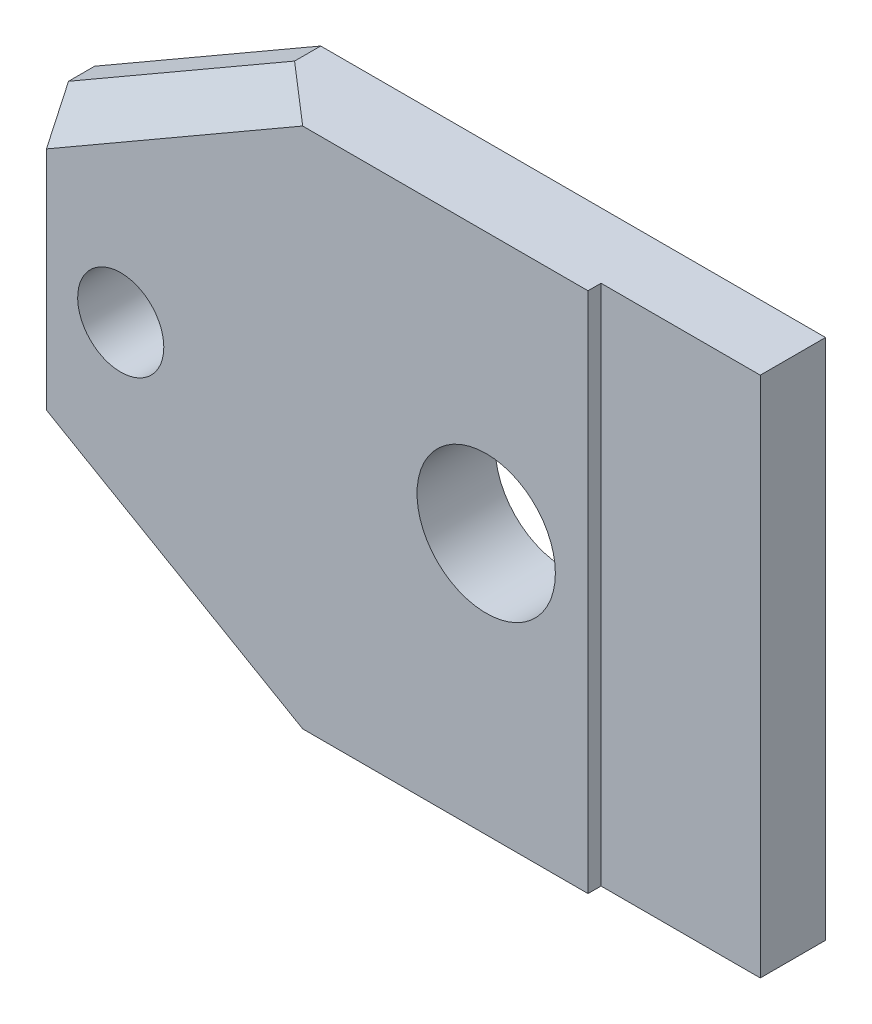
ISO-10303-21;
HEADER;
FILE_DESCRIPTION(('STEP AP214'),'2;1');
FILE_NAME('part.step','',(''),(''),'','','');
FILE_SCHEMA(('AUTOMOTIVE_DESIGN { 1 0 10303 214 1 1 1 1 }'));
ENDSEC;
DATA;
#1=APPLICATION_CONTEXT('core data for automotive mechanical design processes');
#2=APPLICATION_PROTOCOL_DEFINITION('international standard','automotive_design',2000,#1);
#3=PRODUCT_CONTEXT('',#1,'mechanical');
#4=PRODUCT('Part','Part','',(#3));
#5=PRODUCT_RELATED_PRODUCT_CATEGORY('part','',(#4));
#6=PRODUCT_DEFINITION_FORMATION('','',#4);
#7=PRODUCT_DEFINITION_CONTEXT('part definition',#1,'design');
#8=PRODUCT_DEFINITION('design','',#6,#7);
#9=PRODUCT_DEFINITION_SHAPE('','',#8);
#10=(LENGTH_UNIT() NAMED_UNIT(*) SI_UNIT(.MILLI.,.METRE.));
#11=(NAMED_UNIT(*) PLANE_ANGLE_UNIT() SI_UNIT($,.RADIAN.));
#12=(NAMED_UNIT(*) SI_UNIT($,.STERADIAN.) SOLID_ANGLE_UNIT());
#13=UNCERTAINTY_MEASURE_WITH_UNIT(LENGTH_MEASURE(1.E-05),#10,'distance_accuracy_value','');
#14=(GEOMETRIC_REPRESENTATION_CONTEXT(3) GLOBAL_UNCERTAINTY_ASSIGNED_CONTEXT((#13)) GLOBAL_UNIT_ASSIGNED_CONTEXT((#10,
#11,#12)) REPRESENTATION_CONTEXT('',''));
#15=CARTESIAN_POINT('',(0.,0.,0.));
#16=DIRECTION('',(0.,0.,1.));
#17=DIRECTION('',(1.,0.,0.));
#18=AXIS2_PLACEMENT_3D('',#15,#16,#17);
#19=CARTESIAN_POINT('',(0.,-8.50000000000195,11.4999999999869));
#20=DIRECTION('',(1.,0.,0.));
#21=DIRECTION('',(0.,-1.30506716544687E-12,1.));
#22=AXIS2_PLACEMENT_3D('',#19,#20,#21);
#23=PLANE('',#22);
#24=DIRECTION('',(0.,-1.30506716544687E-12,1.));
#25=VECTOR('',#24,1.);
#26=CARTESIAN_POINT('',(0.,-3.50000000000194,11.4999999999935));
#27=LINE('',#26,#25);
#28=CARTESIAN_POINT('',(0.,-3.49999999999803,8.49999999999347));
#29=VERTEX_POINT('',#28);
#30=CARTESIAN_POINT('',(0.,-3.49999999999933,9.49999999999346));
#31=VERTEX_POINT('',#30);
#32=EDGE_CURVE('E162',#29,#31,#27,.T.);
#33=ORIENTED_EDGE('',*,*,#32,.T.);
#34=DIRECTION('',(0.,1.,1.30506716544687E-12));
#35=VECTOR('',#34,1.);
#36=CARTESIAN_POINT('',(0.,-8.49999999999934,9.49999999998693));
#37=LINE('',#36,#35);
#38=CARTESIAN_POINT('',(0.,6.50000000000064,9.50000000000651));
#39=VERTEX_POINT('',#38);
#40=EDGE_CURVE('E11',#31,#39,#37,.T.);
#41=ORIENTED_EDGE('',*,*,#40,.T.);
#42=DIRECTION('',(0.,1.30506716544687E-12,-1.));
#43=VECTOR('',#42,1.);
#44=CARTESIAN_POINT('',(0.,6.49999999999803,11.5000000000065));
#45=LINE('',#44,#43);
#46=CARTESIAN_POINT('',(0.,6.50000000000195,8.50000000000652));
#47=VERTEX_POINT('',#46);
#48=EDGE_CURVE('E164',#39,#47,#45,.T.);
#49=ORIENTED_EDGE('',*,*,#48,.T.);
#50=DIRECTION('',(0.,1.,1.30506716544687E-12));
#51=VECTOR('',#50,1.);
#52=CARTESIAN_POINT('',(0.,-8.49999999999804,8.49999999998695));
#53=LINE('',#52,#51);
#54=EDGE_CURVE('E129',#29,#47,#53,.T.);
#55=ORIENTED_EDGE('',*,*,#54,.F.);
#56=EDGE_LOOP('',(#33,#41,#49,#55));
#57=FACE_BOUND('',#56,.T.);
#58=ADVANCED_FACE('F30',(#57),#23,.F.);
#59=CARTESIAN_POINT('',(0.,-8.49999999999804,8.49999999998695));
#60=DIRECTION('',(0.,-1.30506716544687E-12,1.));
#61=DIRECTION('',(0.,-1.,-1.30506716544687E-12));
#62=AXIS2_PLACEMENT_3D('',#59,#60,#61);
#63=PLANE('',#62);
#64=CARTESIAN_POINT('',(18.,1.50000000000196,8.49999999999999));
#65=DIRECTION('',(0.,1.30506716544687E-12,-1.));
#66=DIRECTION('',(0.,1.,1.30506716544687E-12));
#67=AXIS2_PLACEMENT_3D('',#64,#65,#66);
#68=CIRCLE('',#67,2.65);
#69=CARTESIAN_POINT('',(18.,4.15000000000196,8.50000000000346));
#70=VERTEX_POINT('',#69);
#71=EDGE_CURVE('E192',#70,#70,#68,.T.);
#72=ORIENTED_EDGE('',*,*,#71,.F.);
#73=EDGE_LOOP('',(#72));
#74=FACE_BOUND('',#73,.T.);
#75=CARTESIAN_POINT('',(4.,1.50000000000196,8.49999999999999));
#76=DIRECTION('',(0.,1.30506716544687E-12,-1.));
#77=DIRECTION('',(0.,1.,1.30506716544687E-12));
#78=AXIS2_PLACEMENT_3D('',#75,#76,#77);
#79=CIRCLE('',#78,1.65);
#80=CARTESIAN_POINT('',(4.,3.15000000000196,8.50000000000215));
#81=VERTEX_POINT('',#80);
#82=EDGE_CURVE('E202',#81,#81,#79,.T.);
#83=ORIENTED_EDGE('',*,*,#82,.F.);
#84=EDGE_LOOP('',(#83));
#85=FACE_BOUND('',#84,.T.);
#86=ORIENTED_EDGE('',*,*,#54,.T.);
#87=DIRECTION('',(-0.866025403784438,-0.500000000000001,-6.52533582723437E-13));
#88=VECTOR('',#87,1.);
#89=CARTESIAN_POINT('',(0.,6.50000000000195,8.50000000000652));
#90=LINE('',#89,#88);
#91=CARTESIAN_POINT('',(8.66025403784438,11.500000000002,8.50000000001305));
#92=VERTEX_POINT('',#91);
#93=EDGE_CURVE('E168',#47,#92,#90,.F.);
#94=ORIENTED_EDGE('',*,*,#93,.T.);
#95=DIRECTION('',(1.,0.,0.));
#96=VECTOR('',#95,1.);
#97=CARTESIAN_POINT('',(0.,11.500000000002,8.50000000001305));
#98=LINE('',#97,#96);
#99=CARTESIAN_POINT('',(28.,11.500000000002,8.50000000001305));
#100=VERTEX_POINT('',#99);
#101=EDGE_CURVE('E126',#92,#100,#98,.T.);
#102=ORIENTED_EDGE('',*,*,#101,.T.);
#103=DIRECTION('',(0.,1.,1.30506716544687E-12));
#104=VECTOR('',#103,1.);
#105=CARTESIAN_POINT('',(28.,-8.49999999999804,8.49999999998695));
#106=LINE('',#105,#104);
#107=CARTESIAN_POINT('',(28.,-8.49999999999804,8.49999999998695));
#108=VERTEX_POINT('',#107);
#109=EDGE_CURVE('E122',#108,#100,#106,.T.);
#110=ORIENTED_EDGE('',*,*,#109,.F.);
#111=DIRECTION('',(1.,0.,0.));
#112=VECTOR('',#111,1.);
#113=CARTESIAN_POINT('',(0.,-8.49999999999804,8.49999999998695));
#114=LINE('',#113,#112);
#115=CARTESIAN_POINT('',(8.66025403784438,-8.49999999999804,8.49999999998695));
#116=VERTEX_POINT('',#115);
#117=EDGE_CURVE('E108',#116,#108,#114,.T.);
#118=ORIENTED_EDGE('',*,*,#117,.F.);
#119=DIRECTION('',(-0.866025403784438,0.500000000000001,6.52533582723437E-13));
#120=VECTOR('',#119,1.);
#121=CARTESIAN_POINT('',(8.66025403784438,-8.49999999999804,8.49999999998695));
#122=LINE('',#121,#120);
#123=EDGE_CURVE('E166',#116,#29,#122,.T.);
#124=ORIENTED_EDGE('',*,*,#123,.T.);
#125=EDGE_LOOP('',(#86,#94,#102,#110,#118,#124));
#126=FACE_BOUND('',#125,.T.);
#127=ADVANCED_FACE('F124',(#74,#85,#126),#63,.F.);
#128=CARTESIAN_POINT('',(28.,-8.49999999999804,8.49999999998695));
#129=DIRECTION('',(-1.,0.,0.));
#130=DIRECTION('',(0.,-1.,-1.30506716544687E-12));
#131=AXIS2_PLACEMENT_3D('',#128,#129,#130);
#132=PLANE('',#131);
#133=DIRECTION('',(0.,-1.30506716544687E-12,1.));
#134=VECTOR('',#133,1.);
#135=CARTESIAN_POINT('',(28.,11.500000000002,8.50000000001305));
#136=LINE('',#135,#134);
#137=CARTESIAN_POINT('',(28.,11.4999999999987,11.000000000013));
#138=VERTEX_POINT('',#137);
#139=EDGE_CURVE('E146',#100,#138,#136,.T.);
#140=ORIENTED_EDGE('',*,*,#139,.T.);
#141=DIRECTION('',(0.,1.,1.30506716544687E-12));
#142=VECTOR('',#141,1.);
#143=CARTESIAN_POINT('',(28.,-8.5000000000013,10.9999999999869));
#144=LINE('',#143,#142);
#145=CARTESIAN_POINT('',(28.,-8.5000000000013,10.9999999999869));
#146=VERTEX_POINT('',#145);
#147=EDGE_CURVE('E130',#146,#138,#144,.T.);
#148=ORIENTED_EDGE('',*,*,#147,.F.);
#149=DIRECTION('',(0.,-1.30506716544687E-12,1.));
#150=VECTOR('',#149,1.);
#151=CARTESIAN_POINT('',(28.,-8.49999999999804,8.49999999998695));
#152=LINE('',#151,#150);
#153=EDGE_CURVE('E113',#108,#146,#152,.T.);
#154=ORIENTED_EDGE('',*,*,#153,.F.);
#155=ORIENTED_EDGE('',*,*,#109,.T.);
#156=EDGE_LOOP('',(#140,#148,#154,#155));
#157=FACE_BOUND('',#156,.T.);
#158=ADVANCED_FACE('F132',(#157),#132,.F.);
#159=CARTESIAN_POINT('',(28.,-8.5000000000013,10.9999999999869));
#160=DIRECTION('',(0.,1.30506716544687E-12,-1.));
#161=DIRECTION('',(1.,0.,0.));
#162=AXIS2_PLACEMENT_3D('',#159,#160,#161);
#163=PLANE('',#162);
#164=DIRECTION('',(-1.,0.,0.));
#165=VECTOR('',#164,1.);
#166=CARTESIAN_POINT('',(28.,11.4999999999987,11.000000000013));
#167=LINE('',#166,#165);
#168=CARTESIAN_POINT('',(21.9,11.4999999999987,11.000000000013));
#169=VERTEX_POINT('',#168);
#170=EDGE_CURVE('E149',#138,#169,#167,.T.);
#171=ORIENTED_EDGE('',*,*,#170,.T.);
#172=DIRECTION('',(0.,1.,1.30506716544687E-12));
#173=VECTOR('',#172,1.);
#174=CARTESIAN_POINT('',(21.9,-8.5000000000013,10.9999999999869));
#175=LINE('',#174,#173);
#176=CARTESIAN_POINT('',(21.9,-8.5000000000013,10.9999999999869));
#177=VERTEX_POINT('',#176);
#178=EDGE_CURVE('E157',#177,#169,#175,.T.);
#179=ORIENTED_EDGE('',*,*,#178,.F.);
#180=DIRECTION('',(-1.,0.,0.));
#181=VECTOR('',#180,1.);
#182=CARTESIAN_POINT('',(28.,-8.5000000000013,10.9999999999869));
#183=LINE('',#182,#181);
#184=EDGE_CURVE('E135',#146,#177,#183,.T.);
#185=ORIENTED_EDGE('',*,*,#184,.F.);
#186=ORIENTED_EDGE('',*,*,#147,.T.);
#187=EDGE_LOOP('',(#171,#179,#185,#186));
#188=FACE_BOUND('',#187,.T.);
#189=ADVANCED_FACE('F234',(#188),#163,.F.);
#190=CARTESIAN_POINT('',(21.9,-8.5000000000013,10.9999999999869));
#191=DIRECTION('',(-1.,0.,0.));
#192=DIRECTION('',(0.,-1.,-1.30506716544687E-12));
#193=AXIS2_PLACEMENT_3D('',#190,#191,#192);
#194=PLANE('',#193);
#195=DIRECTION('',(0.,-1.30506716544687E-12,1.));
#196=VECTOR('',#195,1.);
#197=CARTESIAN_POINT('',(21.9,11.4999999999987,11.000000000013));
#198=LINE('',#197,#196);
#199=CARTESIAN_POINT('',(21.9,11.499999999998,11.500000000013));
#200=VERTEX_POINT('',#199);
#201=EDGE_CURVE('E151',#169,#200,#198,.T.);
#202=ORIENTED_EDGE('',*,*,#201,.T.);
#203=DIRECTION('',(0.,1.,1.30506716544687E-12));
#204=VECTOR('',#203,1.);
#205=CARTESIAN_POINT('',(21.9,-8.50000000000195,11.4999999999869));
#206=LINE('',#205,#204);
#207=CARTESIAN_POINT('',(21.9,-8.50000000000195,11.4999999999869));
#208=VERTEX_POINT('',#207);
#209=EDGE_CURVE('E144',#208,#200,#206,.T.);
#210=ORIENTED_EDGE('',*,*,#209,.F.);
#211=DIRECTION('',(0.,-1.30506716544687E-12,1.));
#212=VECTOR('',#211,1.);
#213=CARTESIAN_POINT('',(21.9,-8.5000000000013,10.9999999999869));
#214=LINE('',#213,#212);
#215=EDGE_CURVE('E137',#177,#208,#214,.T.);
#216=ORIENTED_EDGE('',*,*,#215,.F.);
#217=ORIENTED_EDGE('',*,*,#178,.T.);
#218=EDGE_LOOP('',(#202,#210,#216,#217));
#219=FACE_BOUND('',#218,.T.);
#220=ADVANCED_FACE('F215',(#219),#194,.F.);
#221=CARTESIAN_POINT('',(21.9,-8.50000000000195,11.4999999999869));
#222=DIRECTION('',(0.,1.30506716544687E-12,-1.));
#223=DIRECTION('',(1.,0.,0.));
#224=AXIS2_PLACEMENT_3D('',#221,#222,#223);
#225=PLANE('',#224);
#226=CARTESIAN_POINT('',(18.,1.49999999999804,11.5));
#227=DIRECTION('',(0.,1.30506716544687E-12,-1.));
#228=DIRECTION('',(1.,0.,0.));
#229=AXIS2_PLACEMENT_3D('',#226,#227,#228);
#230=CIRCLE('',#229,2.65);
#231=CARTESIAN_POINT('',(20.65,1.49999999999804,11.5));
#232=VERTEX_POINT('',#231);
#233=EDGE_CURVE('E197',#232,#232,#230,.F.);
#234=ORIENTED_EDGE('',*,*,#233,.F.);
#235=EDGE_LOOP('',(#234));
#236=FACE_BOUND('',#235,.T.);
#237=CARTESIAN_POINT('',(4.,1.49999999999804,11.5));
#238=DIRECTION('',(0.,1.30506716544687E-12,-1.));
#239=DIRECTION('',(1.,0.,0.));
#240=AXIS2_PLACEMENT_3D('',#237,#238,#239);
#241=CIRCLE('',#240,1.65);
#242=CARTESIAN_POINT('',(5.65,1.49999999999804,11.5));
#243=VERTEX_POINT('',#242);
#244=EDGE_CURVE('E147',#243,#243,#241,.F.);
#245=ORIENTED_EDGE('',*,*,#244,.F.);
#246=EDGE_LOOP('',(#245));
#247=FACE_BOUND('',#246,.T.);
#248=DIRECTION('',(0.,-1.,-1.30506716544687E-12));
#249=VECTOR('',#248,1.);
#250=CARTESIAN_POINT('',(1.15470053837925,-8.50000000000195,11.4999999999869));
#251=LINE('',#250,#249);
#252=CARTESIAN_POINT('',(1.15470053837925,5.83333333333137,11.5000000000057));
#253=VERTEX_POINT('',#252);
#254=CARTESIAN_POINT('',(1.15470053837925,-2.83333333333528,11.4999999999943));
#255=VERTEX_POINT('',#254);
#256=EDGE_CURVE('E173',#253,#255,#251,.T.);
#257=ORIENTED_EDGE('',*,*,#256,.T.);
#258=DIRECTION('',(0.866025403784438,-0.500000000000001,-6.5243068446325E-13));
#259=VECTOR('',#258,1.);
#260=CARTESIAN_POINT('',(9.23760430703402,-7.50000000000196,11.4999999999883));
#261=LINE('',#260,#259);
#262=CARTESIAN_POINT('',(10.9696551146029,-8.50000000000195,11.4999999999869));
#263=VERTEX_POINT('',#262);
#264=EDGE_CURVE('E177',#255,#263,#261,.T.);
#265=ORIENTED_EDGE('',*,*,#264,.T.);
#266=DIRECTION('',(-1.,0.,0.));
#267=VECTOR('',#266,1.);
#268=CARTESIAN_POINT('',(21.9,-8.50000000000195,11.4999999999869));
#269=LINE('',#268,#267);
#270=EDGE_CURVE('E142',#208,#263,#269,.T.);
#271=ORIENTED_EDGE('',*,*,#270,.F.);
#272=ORIENTED_EDGE('',*,*,#209,.T.);
#273=DIRECTION('',(-1.,0.,0.));
#274=VECTOR('',#273,1.);
#275=CARTESIAN_POINT('',(21.9,11.499999999998,11.500000000013));
#276=LINE('',#275,#274);
#277=CARTESIAN_POINT('',(10.9696551146029,11.499999999998,11.500000000013));
#278=VERTEX_POINT('',#277);
#279=EDGE_CURVE('E119',#200,#278,#276,.T.);
#280=ORIENTED_EDGE('',*,*,#279,.T.);
#281=DIRECTION('',(-0.866025403784438,-0.500000000000001,-6.52636480983625E-13));
#282=VECTOR('',#281,1.);
#283=CARTESIAN_POINT('',(0.577350269189625,5.49999999999804,11.5000000000052));
#284=LINE('',#283,#282);
#285=EDGE_CURVE('E175',#278,#253,#284,.T.);
#286=ORIENTED_EDGE('',*,*,#285,.T.);
#287=EDGE_LOOP('',(#257,#265,#271,#272,#280,#286));
#288=FACE_BOUND('',#287,.T.);
#289=ADVANCED_FACE('F212',(#236,#247,#288),#225,.F.);
#290=CARTESIAN_POINT('',(0.,-8.49999999999804,8.49999999998695));
#291=DIRECTION('',(0.,-1.,-1.30506716544687E-12));
#292=DIRECTION('',(1.,0.,0.));
#293=AXIS2_PLACEMENT_3D('',#290,#291,#292);
#294=PLANE('',#293);
#295=ORIENTED_EDGE('',*,*,#270,.T.);
#296=DIRECTION('',(-0.755928946018452,8.54367010380253E-13,-0.65465367070798));
#297=VECTOR('',#296,1.);
#298=CARTESIAN_POINT('',(3.2166657854851,-8.49999999999319,4.78571428570122));
#299=LINE('',#298,#297);
#300=CARTESIAN_POINT('',(8.66025403784438,-8.49999999999934,9.49999999998693));
#301=VERTEX_POINT('',#300);
#302=EDGE_CURVE('E180',#263,#301,#299,.T.);
#303=ORIENTED_EDGE('',*,*,#302,.T.);
#304=DIRECTION('',(0.,1.30506716544687E-12,-1.));
#305=VECTOR('',#304,1.);
#306=CARTESIAN_POINT('',(8.66025403784438,-8.49999999999804,8.49999999998694));
#307=LINE('',#306,#305);
#308=EDGE_CURVE('E116',#301,#116,#307,.T.);
#309=ORIENTED_EDGE('',*,*,#308,.T.);
#310=ORIENTED_EDGE('',*,*,#117,.T.);
#311=ORIENTED_EDGE('',*,*,#153,.T.);
#312=ORIENTED_EDGE('',*,*,#184,.T.);
#313=ORIENTED_EDGE('',*,*,#215,.T.);
#314=EDGE_LOOP('',(#295,#303,#309,#310,#311,#312,#313));
#315=FACE_BOUND('',#314,.T.);
#316=ADVANCED_FACE('F111',(#315),#294,.T.);
#317=CARTESIAN_POINT('',(0.,11.500000000002,8.50000000001305));
#318=DIRECTION('',(0.,-1.,-1.30506716544687E-12));
#319=DIRECTION('',(1.,0.,0.));
#320=AXIS2_PLACEMENT_3D('',#317,#318,#319);
#321=PLANE('',#320);
#322=DIRECTION('',(0.,-1.30506716544687E-12,1.));
#323=VECTOR('',#322,1.);
#324=CARTESIAN_POINT('',(8.66025403784438,11.500000000002,8.50000000001304));
#325=LINE('',#324,#323);
#326=CARTESIAN_POINT('',(8.66025403784438,11.5000000000007,9.50000000001303));
#327=VERTEX_POINT('',#326);
#328=EDGE_CURVE('E170',#92,#327,#325,.T.);
#329=ORIENTED_EDGE('',*,*,#328,.T.);
#330=DIRECTION('',(-0.755928946018451,8.54367010380255E-13,-0.654653670707981));
#331=VECTOR('',#330,1.);
#332=CARTESIAN_POINT('',(10.705372043862,11.4999999999983,11.2711241469613));
#333=LINE('',#332,#331);
#334=EDGE_CURVE('E39',#327,#278,#333,.F.);
#335=ORIENTED_EDGE('',*,*,#334,.T.);
#336=ORIENTED_EDGE('',*,*,#279,.F.);
#337=ORIENTED_EDGE('',*,*,#201,.F.);
#338=ORIENTED_EDGE('',*,*,#170,.F.);
#339=ORIENTED_EDGE('',*,*,#139,.F.);
#340=ORIENTED_EDGE('',*,*,#101,.F.);
#341=EDGE_LOOP('',(#329,#335,#336,#337,#338,#339,#340));
#342=FACE_BOUND('',#341,.T.);
#343=ADVANCED_FACE('F229',(#342),#321,.F.);
#344=CARTESIAN_POINT('',(4.,1.49999999998826,18.9953318805774));
#345=DIRECTION('',(0.,1.30506716544687E-12,-1.));
#346=DIRECTION('',(0.,1.,1.30506716544687E-12));
#347=AXIS2_PLACEMENT_3D('',#344,#345,#346);
#348=CYLINDRICAL_SURFACE('',#347,1.65);
#349=ORIENTED_EDGE('',*,*,#244,.T.);
#350=EDGE_LOOP('',(#349));
#351=FACE_BOUND('',#350,.T.);
#352=ORIENTED_EDGE('',*,*,#82,.T.);
#353=EDGE_LOOP('',(#352));
#354=FACE_BOUND('',#353,.T.);
#355=ADVANCED_FACE('F209',(#351,#354),#348,.F.);
#356=CARTESIAN_POINT('',(18.,1.49999999998826,18.9953318805774));
#357=DIRECTION('',(0.,1.30506716544687E-12,-1.));
#358=DIRECTION('',(0.,1.,1.30506716544687E-12));
#359=AXIS2_PLACEMENT_3D('',#356,#357,#358);
#360=CYLINDRICAL_SURFACE('',#359,2.65);
#361=ORIENTED_EDGE('',*,*,#233,.T.);
#362=EDGE_LOOP('',(#361));
#363=FACE_BOUND('',#362,.T.);
#364=ORIENTED_EDGE('',*,*,#71,.T.);
#365=EDGE_LOOP('',(#364));
#366=FACE_BOUND('',#365,.T.);
#367=ADVANCED_FACE('F257',(#363,#366),#360,.F.);
#368=CARTESIAN_POINT('',(0.,6.49999999999803,11.5000000000065));
#369=DIRECTION('',(0.500000000000001,-0.866025403784438,-1.1303217389338E-12));
#370=DIRECTION('',(0.866025403784438,0.500000000000001,6.52533582723437E-13));
#371=AXIS2_PLACEMENT_3D('',#368,#369,#370);
#372=PLANE('',#371);
#373=ORIENTED_EDGE('',*,*,#48,.F.);
#374=DIRECTION('',(-0.866025403784438,-0.500000000000001,-6.52636480983625E-13));
#375=VECTOR('',#374,1.);
#376=CARTESIAN_POINT('',(8.6602540378444,11.5000000000007,9.50000000001303));
#377=LINE('',#376,#375);
#378=EDGE_CURVE('E52',#39,#327,#377,.F.);
#379=ORIENTED_EDGE('',*,*,#378,.T.);
#380=ORIENTED_EDGE('',*,*,#328,.F.);
#381=ORIENTED_EDGE('',*,*,#93,.F.);
#382=EDGE_LOOP('',(#373,#379,#380,#381));
#383=FACE_BOUND('',#382,.T.);
#384=ADVANCED_FACE('F227',(#383),#372,.F.);
#385=CARTESIAN_POINT('',(8.66025403784438,-8.49999999999804,8.49999999998694));
#386=DIRECTION('',(-0.500000000000001,-0.866025403784438,-1.13012089891008E-12));
#387=DIRECTION('',(0.866025403784438,-0.500000000000001,-6.52533582723437E-13));
#388=AXIS2_PLACEMENT_3D('',#385,#386,#387);
#389=PLANE('',#388);
#390=ORIENTED_EDGE('',*,*,#308,.F.);
#391=DIRECTION('',(-0.866025403784438,0.500000000000001,6.5243068446325E-13));
#392=VECTOR('',#391,1.);
#393=CARTESIAN_POINT('',(0.,-3.49999999999933,9.49999999999345));
#394=LINE('',#393,#392);
#395=EDGE_CURVE('E182',#301,#31,#394,.T.);
#396=ORIENTED_EDGE('',*,*,#395,.T.);
#397=ORIENTED_EDGE('',*,*,#32,.F.);
#398=ORIENTED_EDGE('',*,*,#123,.F.);
#399=EDGE_LOOP('',(#390,#396,#397,#398));
#400=FACE_BOUND('',#399,.T.);
#401=ADVANCED_FACE('F223',(#400),#389,.T.);
#402=CARTESIAN_POINT('',(10.5071597408063,11.2329781714376,11.5000000000127));
#403=DIRECTION('',(0.433012701892221,-0.749999999999349,-0.500000000000975));
#404=DIRECTION('',(0.,0.554700196226312,-0.832050294337122));
#405=AXIS2_PLACEMENT_3D('',#402,#403,#404);
#406=PLANE('',#405);
#407=ORIENTED_EDGE('',*,*,#334,.F.);
#408=ORIENTED_EDGE('',*,*,#378,.F.);
#409=DIRECTION('',(-0.48038446141526,0.277350098113697,-0.832050294337484));
#410=VECTOR('',#409,1.);
#411=CARTESIAN_POINT('',(1.99852016257944,5.34615384615,12.9615384615434));
#412=LINE('',#411,#410);
#413=EDGE_CURVE('E34',#253,#39,#412,.T.);
#414=ORIENTED_EDGE('',*,*,#413,.F.);
#415=ORIENTED_EDGE('',*,*,#285,.F.);
#416=EDGE_LOOP('',(#407,#408,#414,#415));
#417=FACE_BOUND('',#416,.T.);
#418=ADVANCED_FACE('F32',(#417),#406,.F.);
#419=CARTESIAN_POINT('',(0.,-8.49999999999934,9.49999999998693));
#420=DIRECTION('',(0.86602540378444,6.52533582723433E-13,-0.499999999999998));
#421=DIRECTION('',(0.499999999999998,-1.13022131892194E-12,0.86602540378444));
#422=AXIS2_PLACEMENT_3D('',#419,#420,#421);
#423=PLANE('',#422);
#424=ORIENTED_EDGE('',*,*,#413,.T.);
#425=ORIENTED_EDGE('',*,*,#40,.F.);
#426=DIRECTION('',(-0.48038446141526,-0.277350098111527,-0.832050294338207));
#427=VECTOR('',#426,1.);
#428=CARTESIAN_POINT('',(-0.666173387526486,-3.88461538461321,8.3461538461468));
#429=LINE('',#428,#427);
#430=EDGE_CURVE('E185',#255,#31,#429,.T.);
#431=ORIENTED_EDGE('',*,*,#430,.F.);
#432=ORIENTED_EDGE('',*,*,#256,.F.);
#433=EDGE_LOOP('',(#424,#425,#431,#432));
#434=FACE_BOUND('',#433,.T.);
#435=ADVANCED_FACE('F220',(#434),#423,.F.);
#436=CARTESIAN_POINT('',(19.1674137786507,-13.2329781714416,11.4999999999808));
#437=DIRECTION('',(-0.433012701892221,-0.750000000000653,0.499999999999019));
#438=DIRECTION('',(0.,-0.554700196224141,-0.832050294338569));
#439=AXIS2_PLACEMENT_3D('',#436,#437,#438);
#440=PLANE('',#439);
#441=ORIENTED_EDGE('',*,*,#430,.T.);
#442=ORIENTED_EDGE('',*,*,#395,.F.);
#443=ORIENTED_EDGE('',*,*,#302,.F.);
#444=ORIENTED_EDGE('',*,*,#264,.F.);
#445=EDGE_LOOP('',(#441,#442,#443,#444));
#446=FACE_BOUND('',#445,.T.);
#447=ADVANCED_FACE('F221',(#446),#440,.T.);
#448=CLOSED_SHELL('',(#58,#127,#158,#189,#220,#289,#316,#343,#355,#367,#384,#401,#418,#435,#447));
#449=MANIFOLD_SOLID_BREP('B2',#448);
#450=ADVANCED_BREP_SHAPE_REPRESENTATION('',(#18,#449),#14);
#451=SHAPE_DEFINITION_REPRESENTATION(#9,#450);
ENDSEC;
END-ISO-10303-21;
